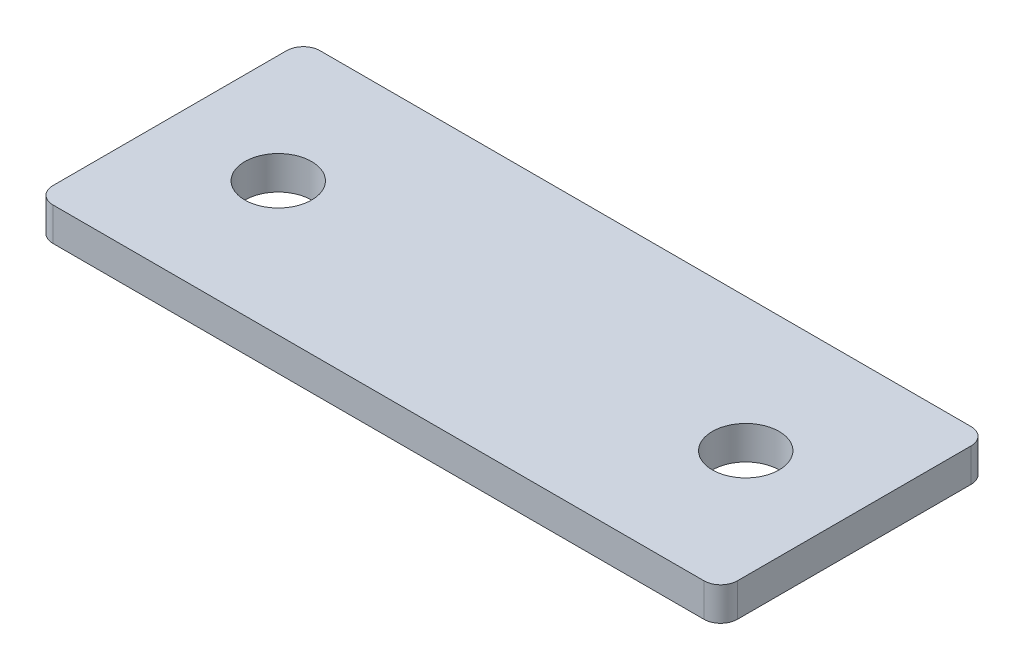
ISO-10303-21;
HEADER;
FILE_DESCRIPTION(('STEP AP214'),'2;1');
FILE_NAME('part.step','',(''),(''),'','','');
FILE_SCHEMA(('AUTOMOTIVE_DESIGN { 1 0 10303 214 1 1 1 1 }'));
ENDSEC;
DATA;
#1=APPLICATION_CONTEXT('core data for automotive mechanical design processes');
#2=APPLICATION_PROTOCOL_DEFINITION('international standard','automotive_design',2000,#1);
#3=PRODUCT_CONTEXT('',#1,'mechanical');
#4=PRODUCT('Part','Part','',(#3));
#5=PRODUCT_RELATED_PRODUCT_CATEGORY('part','',(#4));
#6=PRODUCT_DEFINITION_FORMATION('','',#4);
#7=PRODUCT_DEFINITION_CONTEXT('part definition',#1,'design');
#8=PRODUCT_DEFINITION('design','',#6,#7);
#9=PRODUCT_DEFINITION_SHAPE('','',#8);
#10=(LENGTH_UNIT() NAMED_UNIT(*) SI_UNIT(.MILLI.,.METRE.));
#11=(NAMED_UNIT(*) PLANE_ANGLE_UNIT() SI_UNIT($,.RADIAN.));
#12=(NAMED_UNIT(*) SI_UNIT($,.STERADIAN.) SOLID_ANGLE_UNIT());
#13=UNCERTAINTY_MEASURE_WITH_UNIT(LENGTH_MEASURE(1.E-05),#10,'distance_accuracy_value','');
#14=(GEOMETRIC_REPRESENTATION_CONTEXT(3) GLOBAL_UNCERTAINTY_ASSIGNED_CONTEXT((#13)) GLOBAL_UNIT_ASSIGNED_CONTEXT((#10,
#11,#12)) REPRESENTATION_CONTEXT('',''));
#15=CARTESIAN_POINT('',(0.,0.,0.));
#16=DIRECTION('',(0.,0.,1.));
#17=DIRECTION('',(1.,0.,0.));
#18=AXIS2_PLACEMENT_3D('',#15,#16,#17);
#19=CARTESIAN_POINT('',(0.,2.,0.));
#20=DIRECTION('',(0.,1.,0.));
#21=DIRECTION('',(0.,0.,1.));
#22=AXIS2_PLACEMENT_3D('',#19,#20,#21);
#23=PLANE('',#22);
#24=CARTESIAN_POINT('',(-14.,2.,0.));
#25=DIRECTION('',(0.,1.,0.));
#26=DIRECTION('',(0.,0.,1.));
#27=AXIS2_PLACEMENT_3D('',#24,#25,#26);
#28=CIRCLE('',#27,2.);
#29=CARTESIAN_POINT('',(-14.,2.,2.));
#30=VERTEX_POINT('',#29);
#31=EDGE_CURVE('E122',#30,#30,#28,.T.);
#32=ORIENTED_EDGE('',*,*,#31,.F.);
#33=EDGE_LOOP('',(#32));
#34=FACE_BOUND('',#33,.T.);
#35=DIRECTION('',(0.,0.,-1.));
#36=VECTOR('',#35,1.);
#37=CARTESIAN_POINT('',(20.5,2.,-8.));
#38=LINE('',#37,#36);
#39=CARTESIAN_POINT('',(20.5,2.,7.));
#40=VERTEX_POINT('',#39);
#41=CARTESIAN_POINT('',(20.5,2.,-7.));
#42=VERTEX_POINT('',#41);
#43=EDGE_CURVE('E116',#40,#42,#38,.T.);
#44=ORIENTED_EDGE('',*,*,#43,.T.);
#45=CARTESIAN_POINT('',(19.5,2.,-7.));
#46=DIRECTION('',(0.,1.,0.));
#47=DIRECTION('',(0.,0.,1.));
#48=AXIS2_PLACEMENT_3D('',#45,#46,#47);
#49=CIRCLE('',#48,1.);
#50=CARTESIAN_POINT('',(19.5,2.,-8.));
#51=VERTEX_POINT('',#50);
#52=EDGE_CURVE('E11',#42,#51,#49,.T.);
#53=ORIENTED_EDGE('',*,*,#52,.T.);
#54=DIRECTION('',(-1.,0.,0.));
#55=VECTOR('',#54,1.);
#56=CARTESIAN_POINT('',(-20.5,2.,-8.));
#57=LINE('',#56,#55);
#58=CARTESIAN_POINT('',(-19.5,2.,-8.));
#59=VERTEX_POINT('',#58);
#60=EDGE_CURVE('E167',#51,#59,#57,.T.);
#61=ORIENTED_EDGE('',*,*,#60,.T.);
#62=CARTESIAN_POINT('',(-19.5,2.,-7.));
#63=DIRECTION('',(0.,1.,0.));
#64=DIRECTION('',(0.,0.,1.));
#65=AXIS2_PLACEMENT_3D('',#62,#63,#64);
#66=CIRCLE('',#65,1.);
#67=CARTESIAN_POINT('',(-20.5,2.,-7.));
#68=VERTEX_POINT('',#67);
#69=EDGE_CURVE('E158',#59,#68,#66,.T.);
#70=ORIENTED_EDGE('',*,*,#69,.T.);
#71=DIRECTION('',(0.,0.,1.));
#72=VECTOR('',#71,1.);
#73=CARTESIAN_POINT('',(-20.5,2.,-8.));
#74=LINE('',#73,#72);
#75=CARTESIAN_POINT('',(-20.5,2.,7.));
#76=VERTEX_POINT('',#75);
#77=EDGE_CURVE('E179',#68,#76,#74,.T.);
#78=ORIENTED_EDGE('',*,*,#77,.T.);
#79=CARTESIAN_POINT('',(-19.5,2.,7.));
#80=DIRECTION('',(0.,1.,0.));
#81=DIRECTION('',(0.,0.,1.));
#82=AXIS2_PLACEMENT_3D('',#79,#80,#81);
#83=CIRCLE('',#82,1.);
#84=CARTESIAN_POINT('',(-19.5,2.,8.));
#85=VERTEX_POINT('',#84);
#86=EDGE_CURVE('E147',#76,#85,#83,.T.);
#87=ORIENTED_EDGE('',*,*,#86,.T.);
#88=DIRECTION('',(1.,0.,0.));
#89=VECTOR('',#88,1.);
#90=CARTESIAN_POINT('',(-20.5,2.,8.));
#91=LINE('',#90,#89);
#92=CARTESIAN_POINT('',(19.5,2.,8.));
#93=VERTEX_POINT('',#92);
#94=EDGE_CURVE('E117',#85,#93,#91,.T.);
#95=ORIENTED_EDGE('',*,*,#94,.T.);
#96=CARTESIAN_POINT('',(19.5,2.,7.));
#97=DIRECTION('',(0.,1.,0.));
#98=DIRECTION('',(0.,0.,1.));
#99=AXIS2_PLACEMENT_3D('',#96,#97,#98);
#100=CIRCLE('',#99,1.);
#101=EDGE_CURVE('E136',#93,#40,#100,.T.);
#102=ORIENTED_EDGE('',*,*,#101,.T.);
#103=EDGE_LOOP('',(#44,#53,#61,#70,#78,#87,#95,#102));
#104=FACE_BOUND('',#103,.T.);
#105=CARTESIAN_POINT('',(14.,2.,0.));
#106=DIRECTION('',(0.,1.,0.));
#107=DIRECTION('',(0.,0.,-1.));
#108=AXIS2_PLACEMENT_3D('',#105,#106,#107);
#109=CIRCLE('',#108,2.);
#110=CARTESIAN_POINT('',(14.,2.,-2.));
#111=VERTEX_POINT('',#110);
#112=EDGE_CURVE('E188',#111,#111,#109,.T.);
#113=ORIENTED_EDGE('',*,*,#112,.F.);
#114=EDGE_LOOP('',(#113));
#115=FACE_BOUND('',#114,.T.);
#116=ADVANCED_FACE('F39',(#34,#104,#115),#23,.T.);
#117=CARTESIAN_POINT('',(0.,0.,0.));
#118=DIRECTION('',(0.,1.,0.));
#119=DIRECTION('',(0.,0.,1.));
#120=AXIS2_PLACEMENT_3D('',#117,#118,#119);
#121=PLANE('',#120);
#122=DIRECTION('',(-1.,0.,0.));
#123=VECTOR('',#122,1.);
#124=CARTESIAN_POINT('',(-20.5,0.,-8.));
#125=LINE('',#124,#123);
#126=CARTESIAN_POINT('',(19.5,0.,-8.));
#127=VERTEX_POINT('',#126);
#128=CARTESIAN_POINT('',(-19.5,0.,-8.));
#129=VERTEX_POINT('',#128);
#130=EDGE_CURVE('E121',#127,#129,#125,.T.);
#131=ORIENTED_EDGE('',*,*,#130,.F.);
#132=CARTESIAN_POINT('',(19.5,0.,-7.));
#133=DIRECTION('',(0.,1.,0.));
#134=DIRECTION('',(0.,0.,1.));
#135=AXIS2_PLACEMENT_3D('',#132,#133,#134);
#136=CIRCLE('',#135,1.);
#137=CARTESIAN_POINT('',(20.5,0.,-7.));
#138=VERTEX_POINT('',#137);
#139=EDGE_CURVE('E61',#127,#138,#136,.F.);
#140=ORIENTED_EDGE('',*,*,#139,.T.);
#141=DIRECTION('',(0.,0.,-1.));
#142=VECTOR('',#141,1.);
#143=CARTESIAN_POINT('',(20.5,0.,-8.));
#144=LINE('',#143,#142);
#145=CARTESIAN_POINT('',(20.5,0.,7.));
#146=VERTEX_POINT('',#145);
#147=EDGE_CURVE('E115',#146,#138,#144,.T.);
#148=ORIENTED_EDGE('',*,*,#147,.F.);
#149=CARTESIAN_POINT('',(19.5,0.,7.));
#150=DIRECTION('',(0.,1.,0.));
#151=DIRECTION('',(0.,0.,1.));
#152=AXIS2_PLACEMENT_3D('',#149,#150,#151);
#153=CIRCLE('',#152,1.);
#154=CARTESIAN_POINT('',(19.5,0.,8.));
#155=VERTEX_POINT('',#154);
#156=EDGE_CURVE('E105',#146,#155,#153,.F.);
#157=ORIENTED_EDGE('',*,*,#156,.T.);
#158=DIRECTION('',(1.,0.,0.));
#159=VECTOR('',#158,1.);
#160=CARTESIAN_POINT('',(-20.5,0.,8.));
#161=LINE('',#160,#159);
#162=CARTESIAN_POINT('',(-19.5,0.,8.));
#163=VERTEX_POINT('',#162);
#164=EDGE_CURVE('E133',#163,#155,#161,.T.);
#165=ORIENTED_EDGE('',*,*,#164,.F.);
#166=CARTESIAN_POINT('',(-19.5,0.,7.));
#167=DIRECTION('',(0.,1.,0.));
#168=DIRECTION('',(0.,0.,1.));
#169=AXIS2_PLACEMENT_3D('',#166,#167,#168);
#170=CIRCLE('',#169,1.);
#171=CARTESIAN_POINT('',(-20.5,0.,7.));
#172=VERTEX_POINT('',#171);
#173=EDGE_CURVE('E141',#163,#172,#170,.F.);
#174=ORIENTED_EDGE('',*,*,#173,.T.);
#175=DIRECTION('',(0.,0.,1.));
#176=VECTOR('',#175,1.);
#177=CARTESIAN_POINT('',(-20.5,0.,-8.));
#178=LINE('',#177,#176);
#179=CARTESIAN_POINT('',(-20.5,0.,-7.));
#180=VERTEX_POINT('',#179);
#181=EDGE_CURVE('E124',#180,#172,#178,.T.);
#182=ORIENTED_EDGE('',*,*,#181,.F.);
#183=CARTESIAN_POINT('',(-19.5,0.,-7.));
#184=DIRECTION('',(0.,1.,0.));
#185=DIRECTION('',(0.,0.,1.));
#186=AXIS2_PLACEMENT_3D('',#183,#184,#185);
#187=CIRCLE('',#186,1.);
#188=EDGE_CURVE('E152',#180,#129,#187,.F.);
#189=ORIENTED_EDGE('',*,*,#188,.T.);
#190=EDGE_LOOP('',(#131,#140,#148,#157,#165,#174,#182,#189));
#191=FACE_BOUND('',#190,.T.);
#192=CARTESIAN_POINT('',(-14.,0.,0.));
#193=DIRECTION('',(0.,1.,0.));
#194=DIRECTION('',(0.,0.,1.));
#195=AXIS2_PLACEMENT_3D('',#192,#193,#194);
#196=CIRCLE('',#195,2.);
#197=CARTESIAN_POINT('',(-14.,0.,2.));
#198=VERTEX_POINT('',#197);
#199=EDGE_CURVE('E127',#198,#198,#196,.T.);
#200=ORIENTED_EDGE('',*,*,#199,.T.);
#201=EDGE_LOOP('',(#200));
#202=FACE_BOUND('',#201,.T.);
#203=CARTESIAN_POINT('',(14.,0.,0.));
#204=DIRECTION('',(0.,1.,0.));
#205=DIRECTION('',(0.,0.,-1.));
#206=AXIS2_PLACEMENT_3D('',#203,#204,#205);
#207=CIRCLE('',#206,2.);
#208=CARTESIAN_POINT('',(14.,0.,-2.));
#209=VERTEX_POINT('',#208);
#210=EDGE_CURVE('E190',#209,#209,#207,.T.);
#211=ORIENTED_EDGE('',*,*,#210,.T.);
#212=EDGE_LOOP('',(#211));
#213=FACE_BOUND('',#212,.T.);
#214=ADVANCED_FACE('F119',(#191,#202,#213),#121,.F.);
#215=CARTESIAN_POINT('',(20.5,2.,-8.));
#216=DIRECTION('',(-1.,0.,0.));
#217=DIRECTION('',(0.,0.,1.));
#218=AXIS2_PLACEMENT_3D('',#215,#216,#217);
#219=PLANE('',#218);
#220=ORIENTED_EDGE('',*,*,#147,.T.);
#221=DIRECTION('',(0.,-1.,0.));
#222=VECTOR('',#221,1.);
#223=CARTESIAN_POINT('',(20.5,2.,-7.));
#224=LINE('',#223,#222);
#225=EDGE_CURVE('E47',#138,#42,#224,.F.);
#226=ORIENTED_EDGE('',*,*,#225,.T.);
#227=ORIENTED_EDGE('',*,*,#43,.F.);
#228=DIRECTION('',(0.,-1.,0.));
#229=VECTOR('',#228,1.);
#230=CARTESIAN_POINT('',(20.5,2.,7.));
#231=LINE('',#230,#229);
#232=EDGE_CURVE('E109',#40,#146,#231,.T.);
#233=ORIENTED_EDGE('',*,*,#232,.T.);
#234=EDGE_LOOP('',(#220,#226,#227,#233));
#235=FACE_BOUND('',#234,.T.);
#236=ADVANCED_FACE('F114',(#235),#219,.F.);
#237=CARTESIAN_POINT('',(-20.5,2.,-8.));
#238=DIRECTION('',(0.,0.,1.));
#239=DIRECTION('',(1.,0.,0.));
#240=AXIS2_PLACEMENT_3D('',#237,#238,#239);
#241=PLANE('',#240);
#242=ORIENTED_EDGE('',*,*,#60,.F.);
#243=DIRECTION('',(0.,-1.,0.));
#244=VECTOR('',#243,1.);
#245=CARTESIAN_POINT('',(19.5,2.,-8.));
#246=LINE('',#245,#244);
#247=EDGE_CURVE('E160',#51,#127,#246,.T.);
#248=ORIENTED_EDGE('',*,*,#247,.T.);
#249=ORIENTED_EDGE('',*,*,#130,.T.);
#250=DIRECTION('',(0.,-1.,0.));
#251=VECTOR('',#250,1.);
#252=CARTESIAN_POINT('',(-19.5,2.,-8.));
#253=LINE('',#252,#251);
#254=EDGE_CURVE('E155',#129,#59,#253,.F.);
#255=ORIENTED_EDGE('',*,*,#254,.T.);
#256=EDGE_LOOP('',(#242,#248,#249,#255));
#257=FACE_BOUND('',#256,.T.);
#258=ADVANCED_FACE('F166',(#257),#241,.F.);
#259=CARTESIAN_POINT('',(-20.5,2.,-8.));
#260=DIRECTION('',(1.,0.,0.));
#261=DIRECTION('',(0.,0.,-1.));
#262=AXIS2_PLACEMENT_3D('',#259,#260,#261);
#263=PLANE('',#262);
#264=ORIENTED_EDGE('',*,*,#77,.F.);
#265=DIRECTION('',(0.,-1.,0.));
#266=VECTOR('',#265,1.);
#267=CARTESIAN_POINT('',(-20.5,2.,-7.));
#268=LINE('',#267,#266);
#269=EDGE_CURVE('E149',#68,#180,#268,.T.);
#270=ORIENTED_EDGE('',*,*,#269,.T.);
#271=ORIENTED_EDGE('',*,*,#181,.T.);
#272=DIRECTION('',(0.,-1.,0.));
#273=VECTOR('',#272,1.);
#274=CARTESIAN_POINT('',(-20.5,2.,7.));
#275=LINE('',#274,#273);
#276=EDGE_CURVE('E144',#172,#76,#275,.F.);
#277=ORIENTED_EDGE('',*,*,#276,.T.);
#278=EDGE_LOOP('',(#264,#270,#271,#277));
#279=FACE_BOUND('',#278,.T.);
#280=ADVANCED_FACE('F181',(#279),#263,.F.);
#281=CARTESIAN_POINT('',(-20.5,2.,8.));
#282=DIRECTION('',(0.,0.,-1.));
#283=DIRECTION('',(-1.,0.,0.));
#284=AXIS2_PLACEMENT_3D('',#281,#282,#283);
#285=PLANE('',#284);
#286=ORIENTED_EDGE('',*,*,#94,.F.);
#287=DIRECTION('',(0.,-1.,0.));
#288=VECTOR('',#287,1.);
#289=CARTESIAN_POINT('',(-19.5,2.,8.));
#290=LINE('',#289,#288);
#291=EDGE_CURVE('E138',#85,#163,#290,.T.);
#292=ORIENTED_EDGE('',*,*,#291,.T.);
#293=ORIENTED_EDGE('',*,*,#164,.T.);
#294=DIRECTION('',(0.,-1.,0.));
#295=VECTOR('',#294,1.);
#296=CARTESIAN_POINT('',(19.5,2.,8.));
#297=LINE('',#296,#295);
#298=EDGE_CURVE('E111',#155,#93,#297,.F.);
#299=ORIENTED_EDGE('',*,*,#298,.T.);
#300=EDGE_LOOP('',(#286,#292,#293,#299));
#301=FACE_BOUND('',#300,.T.);
#302=ADVANCED_FACE('F211',(#301),#285,.F.);
#303=CARTESIAN_POINT('',(-14.,2.,0.));
#304=DIRECTION('',(0.,-1.,0.));
#305=DIRECTION('',(0.,0.,-1.));
#306=AXIS2_PLACEMENT_3D('',#303,#304,#305);
#307=CYLINDRICAL_SURFACE('',#306,2.);
#308=ORIENTED_EDGE('',*,*,#31,.T.);
#309=EDGE_LOOP('',(#308));
#310=FACE_BOUND('',#309,.T.);
#311=ORIENTED_EDGE('',*,*,#199,.F.);
#312=EDGE_LOOP('',(#311));
#313=FACE_BOUND('',#312,.T.);
#314=ADVANCED_FACE('F208',(#310,#313),#307,.F.);
#315=CARTESIAN_POINT('',(14.,2.,0.));
#316=DIRECTION('',(0.,-1.,0.));
#317=DIRECTION('',(0.,0.,-1.));
#318=AXIS2_PLACEMENT_3D('',#315,#316,#317);
#319=CYLINDRICAL_SURFACE('',#318,2.);
#320=ORIENTED_EDGE('',*,*,#112,.T.);
#321=EDGE_LOOP('',(#320));
#322=FACE_BOUND('',#321,.T.);
#323=ORIENTED_EDGE('',*,*,#210,.F.);
#324=EDGE_LOOP('',(#323));
#325=FACE_BOUND('',#324,.T.);
#326=ADVANCED_FACE('F196',(#322,#325),#319,.F.);
#327=CARTESIAN_POINT('',(19.5,2.,7.));
#328=DIRECTION('',(0.,-1.,0.));
#329=DIRECTION('',(0.,0.,-1.));
#330=AXIS2_PLACEMENT_3D('',#327,#328,#329);
#331=CYLINDRICAL_SURFACE('',#330,1.);
#332=ORIENTED_EDGE('',*,*,#101,.F.);
#333=ORIENTED_EDGE('',*,*,#298,.F.);
#334=ORIENTED_EDGE('',*,*,#156,.F.);
#335=ORIENTED_EDGE('',*,*,#232,.F.);
#336=EDGE_LOOP('',(#332,#333,#334,#335));
#337=FACE_BOUND('',#336,.T.);
#338=ADVANCED_FACE('F108',(#337),#331,.T.);
#339=CARTESIAN_POINT('',(-19.5,2.,7.));
#340=DIRECTION('',(0.,-1.,0.));
#341=DIRECTION('',(0.,0.,-1.));
#342=AXIS2_PLACEMENT_3D('',#339,#340,#341);
#343=CYLINDRICAL_SURFACE('',#342,1.);
#344=ORIENTED_EDGE('',*,*,#86,.F.);
#345=ORIENTED_EDGE('',*,*,#276,.F.);
#346=ORIENTED_EDGE('',*,*,#173,.F.);
#347=ORIENTED_EDGE('',*,*,#291,.F.);
#348=EDGE_LOOP('',(#344,#345,#346,#347));
#349=FACE_BOUND('',#348,.T.);
#350=ADVANCED_FACE('F223',(#349),#343,.T.);
#351=CARTESIAN_POINT('',(-19.5,2.,-7.));
#352=DIRECTION('',(0.,-1.,0.));
#353=DIRECTION('',(0.,0.,-1.));
#354=AXIS2_PLACEMENT_3D('',#351,#352,#353);
#355=CYLINDRICAL_SURFACE('',#354,1.);
#356=ORIENTED_EDGE('',*,*,#69,.F.);
#357=ORIENTED_EDGE('',*,*,#254,.F.);
#358=ORIENTED_EDGE('',*,*,#188,.F.);
#359=ORIENTED_EDGE('',*,*,#269,.F.);
#360=EDGE_LOOP('',(#356,#357,#358,#359));
#361=FACE_BOUND('',#360,.T.);
#362=ADVANCED_FACE('F175',(#361),#355,.T.);
#363=CARTESIAN_POINT('',(19.5,2.,-7.));
#364=DIRECTION('',(0.,-1.,0.));
#365=DIRECTION('',(0.,0.,-1.));
#366=AXIS2_PLACEMENT_3D('',#363,#364,#365);
#367=CYLINDRICAL_SURFACE('',#366,1.);
#368=ORIENTED_EDGE('',*,*,#52,.F.);
#369=ORIENTED_EDGE('',*,*,#225,.F.);
#370=ORIENTED_EDGE('',*,*,#139,.F.);
#371=ORIENTED_EDGE('',*,*,#247,.F.);
#372=EDGE_LOOP('',(#368,#369,#370,#371));
#373=FACE_BOUND('',#372,.T.);
#374=ADVANCED_FACE('F41',(#373),#367,.T.);
#375=CLOSED_SHELL('',(#116,#214,#236,#258,#280,#302,#314,#326,#338,#350,#362,#374));
#376=MANIFOLD_SOLID_BREP('B2',#375);
#377=ADVANCED_BREP_SHAPE_REPRESENTATION('',(#18,#376),#14);
#378=SHAPE_DEFINITION_REPRESENTATION(#9,#377);
ENDSEC;
END-ISO-10303-21;
